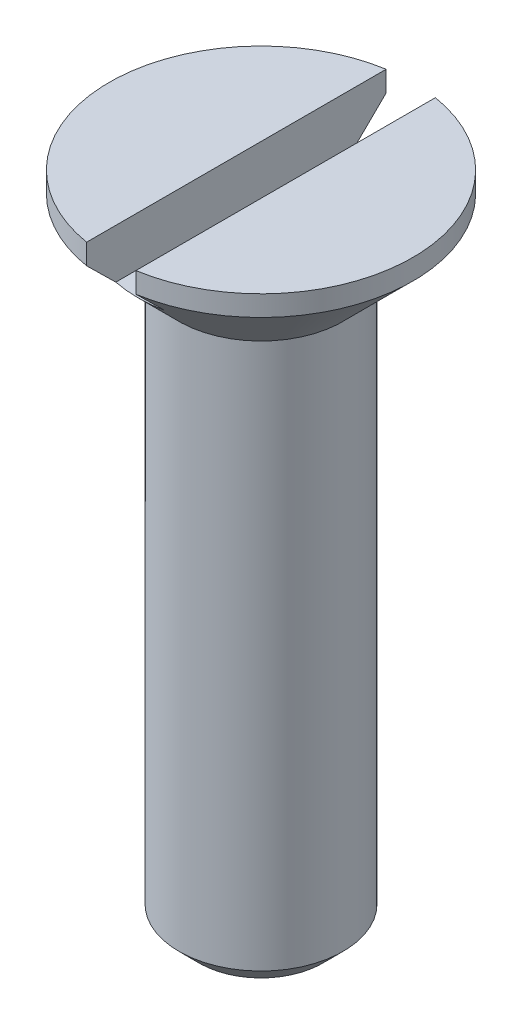
ISO-10303-21;
HEADER;
FILE_DESCRIPTION(('STEP AP214'),'2;1');
FILE_NAME('part.step','',(''),(''),'','','');
FILE_SCHEMA(('AUTOMOTIVE_DESIGN { 1 0 10303 214 1 1 1 1 }'));
ENDSEC;
DATA;
#1=APPLICATION_CONTEXT('core data for automotive mechanical design processes');
#2=APPLICATION_PROTOCOL_DEFINITION('international standard','automotive_design',2000,#1);
#3=PRODUCT_CONTEXT('',#1,'mechanical');
#4=PRODUCT('Part','Part','',(#3));
#5=PRODUCT_RELATED_PRODUCT_CATEGORY('part','',(#4));
#6=PRODUCT_DEFINITION_FORMATION('','',#4);
#7=PRODUCT_DEFINITION_CONTEXT('part definition',#1,'design');
#8=PRODUCT_DEFINITION('design','',#6,#7);
#9=PRODUCT_DEFINITION_SHAPE('','',#8);
#10=(LENGTH_UNIT() NAMED_UNIT(*) SI_UNIT(.MILLI.,.METRE.));
#11=(NAMED_UNIT(*) PLANE_ANGLE_UNIT() SI_UNIT($,.RADIAN.));
#12=(NAMED_UNIT(*) SI_UNIT($,.STERADIAN.) SOLID_ANGLE_UNIT());
#13=UNCERTAINTY_MEASURE_WITH_UNIT(LENGTH_MEASURE(1.E-05),#10,'distance_accuracy_value','');
#14=(GEOMETRIC_REPRESENTATION_CONTEXT(3) GLOBAL_UNCERTAINTY_ASSIGNED_CONTEXT((#13)) GLOBAL_UNIT_ASSIGNED_CONTEXT((#10,
#11,#12)) REPRESENTATION_CONTEXT('',''));
#15=CARTESIAN_POINT('',(0.,0.,0.));
#16=DIRECTION('',(0.,0.,1.));
#17=DIRECTION('',(1.,0.,0.));
#18=AXIS2_PLACEMENT_3D('',#15,#16,#17);
#19=CARTESIAN_POINT('',(-3.7,16.,0.));
#20=DIRECTION('',(0.,1.,0.));
#21=DIRECTION('',(-1.,0.,0.));
#22=AXIS2_PLACEMENT_3D('',#19,#20,#21);
#23=PLANE('',#22);
#24=DIRECTION('',(0.,0.,1.));
#25=VECTOR('',#24,1.);
#26=CARTESIAN_POINT('',(-0.6,16.,-3.7));
#27=LINE('',#26,#25);
#28=CARTESIAN_POINT('',(-0.6,16.,-3.65102725270574));
#29=VERTEX_POINT('',#28);
#30=CARTESIAN_POINT('',(-0.6,16.,3.65102725270574));
#31=VERTEX_POINT('',#30);
#32=EDGE_CURVE('E136',#29,#31,#27,.T.);
#33=ORIENTED_EDGE('',*,*,#32,.F.);
#34=CARTESIAN_POINT('',(0.,16.,0.));
#35=DIRECTION('',(0.,1.,0.));
#36=DIRECTION('',(-1.,0.,0.));
#37=AXIS2_PLACEMENT_3D('',#34,#35,#36);
#38=CIRCLE('',#37,3.7);
#39=EDGE_CURVE('E113',#29,#31,#38,.T.);
#40=ORIENTED_EDGE('',*,*,#39,.T.);
#41=EDGE_LOOP('',(#33,#40));
#42=FACE_BOUND('',#41,.T.);
#43=ADVANCED_FACE('F29',(#42),#23,.T.);
#44=CARTESIAN_POINT('',(0.,16.,0.));
#45=DIRECTION('',(0.,1.,0.));
#46=DIRECTION('',(-1.,0.,0.));
#47=AXIS2_PLACEMENT_3D('',#44,#45,#46);
#48=CYLINDRICAL_SURFACE('',#47,3.7);
#49=DIRECTION('',(0.,1.,0.));
#50=VECTOR('',#49,1.);
#51=CARTESIAN_POINT('',(-0.6,16.,3.65102725270574));
#52=LINE('',#51,#50);
#53=CARTESIAN_POINT('',(-0.6,15.5,3.65102725270574));
#54=VERTEX_POINT('',#53);
#55=EDGE_CURVE('E57',#31,#54,#52,.F.);
#56=ORIENTED_EDGE('',*,*,#55,.F.);
#57=ORIENTED_EDGE('',*,*,#39,.F.);
#58=DIRECTION('',(0.,1.,0.));
#59=VECTOR('',#58,1.);
#60=CARTESIAN_POINT('',(-0.6,16.,-3.65102725270574));
#61=LINE('',#60,#59);
#62=CARTESIAN_POINT('',(-0.6,15.5,-3.65102725270574));
#63=VERTEX_POINT('',#62);
#64=EDGE_CURVE('E130',#63,#29,#61,.T.);
#65=ORIENTED_EDGE('',*,*,#64,.F.);
#66=CARTESIAN_POINT('',(0.,15.5,0.));
#67=DIRECTION('',(0.,1.,0.));
#68=DIRECTION('',(-1.,0.,0.));
#69=AXIS2_PLACEMENT_3D('',#66,#67,#68);
#70=CIRCLE('',#69,3.7);
#71=EDGE_CURVE('E117',#63,#54,#70,.T.);
#72=ORIENTED_EDGE('',*,*,#71,.T.);
#73=EDGE_LOOP('',(#56,#57,#65,#72));
#74=FACE_BOUND('',#73,.T.);
#75=ADVANCED_FACE('F146',(#74),#48,.T.);
#76=DIRECTION('',(0.,0.,1.));
#77=VECTOR('',#76,1.);
#78=CARTESIAN_POINT('',(0.6,16.,-3.7));
#79=LINE('',#78,#77);
#80=CARTESIAN_POINT('',(0.6,16.,-3.65102725270574));
#81=VERTEX_POINT('',#80);
#82=CARTESIAN_POINT('',(0.6,16.,3.65102725270574));
#83=VERTEX_POINT('',#82);
#84=EDGE_CURVE('E100',#81,#83,#79,.T.);
#85=ORIENTED_EDGE('',*,*,#84,.T.);
#86=EDGE_CURVE('E111',#83,#81,#38,.T.);
#87=ORIENTED_EDGE('',*,*,#86,.T.);
#88=EDGE_LOOP('',(#85,#87));
#89=FACE_BOUND('',#88,.T.);
#90=ADVANCED_FACE('F31',(#89),#23,.T.);
#91=DIRECTION('',(0.,1.,0.));
#92=VECTOR('',#91,1.);
#93=CARTESIAN_POINT('',(0.6,16.,-3.65102725270574));
#94=LINE('',#93,#92);
#95=CARTESIAN_POINT('',(0.6,15.5,-3.65102725270574));
#96=VERTEX_POINT('',#95);
#97=EDGE_CURVE('E132',#81,#96,#94,.F.);
#98=ORIENTED_EDGE('',*,*,#97,.F.);
#99=ORIENTED_EDGE('',*,*,#86,.F.);
#100=DIRECTION('',(0.,1.,0.));
#101=VECTOR('',#100,1.);
#102=CARTESIAN_POINT('',(0.6,16.,3.65102725270574));
#103=LINE('',#102,#101);
#104=CARTESIAN_POINT('',(0.6,15.5,3.65102725270574));
#105=VERTEX_POINT('',#104);
#106=EDGE_CURVE('E134',#105,#83,#103,.T.);
#107=ORIENTED_EDGE('',*,*,#106,.F.);
#108=EDGE_CURVE('E106',#105,#96,#70,.T.);
#109=ORIENTED_EDGE('',*,*,#108,.T.);
#110=EDGE_LOOP('',(#98,#99,#107,#109));
#111=FACE_BOUND('',#110,.T.);
#112=ADVANCED_FACE('F153',(#111),#48,.T.);
#113=CARTESIAN_POINT('',(0.,15.5,0.));
#114=DIRECTION('',(0.,1.,0.));
#115=DIRECTION('',(-1.,0.,0.));
#116=AXIS2_PLACEMENT_3D('',#113,#114,#115);
#117=CONICAL_SURFACE('',#116,3.7,0.785398163397443);
#118=CARTESIAN_POINT('',(-0.600000000000001,19.9600206241956,8.13793196010486));
#119=CARTESIAN_POINT('',(-0.600000000000001,19.6768912812845,7.85402777231897));
#120=CARTESIAN_POINT('',(-0.600000000000001,19.3937960861909,7.57008950002177));
#121=CARTESIAN_POINT('',(-0.600000000000001,18.8277099701475,7.00209082271699));
#122=CARTESIAN_POINT('',(-0.600000000000001,18.5447190528461,6.71803041407336));
#123=CARTESIAN_POINT('',(-0.6,17.9786826072545,6.14953775036887));
#124=CARTESIAN_POINT('',(-0.6,17.6956371983772,5.86510537638401));
#125=CARTESIAN_POINT('',(-0.6,17.1297993439922,5.29600682483286));
#126=CARTESIAN_POINT('',(-0.6,16.8470068908349,5.01134065487302));
#127=CARTESIAN_POINT('',(-0.6,16.2857333258305,4.44556875001048));
#128=CARTESIAN_POINT('',(-0.6,16.0072468080645,4.16446838236597));
#129=CARTESIAN_POINT('',(-0.6,15.590024020769,3.74228982182658));
#130=CARTESIAN_POINT('',(-0.6,15.4510275685893,3.60146883259404));
#131=CARTESIAN_POINT('',(-0.6,15.1732845807478,3.31958319518965));
#132=CARTESIAN_POINT('',(-0.6,15.0345380427178,3.17851854935184));
#133=CARTESIAN_POINT('',(-0.6,14.7574716483417,2.89609946410979));
#134=CARTESIAN_POINT('',(-0.6,14.6191516232573,2.75474519043096));
#135=CARTESIAN_POINT('',(-0.6,14.3430715265049,2.47148070482769));
#136=CARTESIAN_POINT('',(-0.6,14.2053114754901,2.32957047277055));
#137=CARTESIAN_POINT('',(-0.6,13.9307416741205,2.04487556787213));
#138=CARTESIAN_POINT('',(-0.6,13.7939317680324,1.90209104591261));
#139=CARTESIAN_POINT('',(-0.6,13.590052838059,1.68665676476746));
#140=CARTESIAN_POINT('',(-0.6,13.5223178394474,1.61463791010643));
#141=CARTESIAN_POINT('',(-0.6,13.3875043812597,1.4699889932015));
#142=CARTESIAN_POINT('',(-0.599999999999999,13.3204259074044,1.39735894431496));
#143=CARTESIAN_POINT('',(-0.599999999999999,13.2173706745269,1.28421539613836));
#144=CARTESIAN_POINT('',(-0.599999999999999,13.1810405202052,1.2440240295227));
#145=CARTESIAN_POINT('',(-0.599999999999999,13.1087770132124,1.16328117926467));
#146=CARTESIAN_POINT('',(-0.599999999999999,13.0728436840885,1.12272967450692));
#147=CARTESIAN_POINT('',(-0.599999999999999,13.0013920679676,1.04102691374381));
#148=CARTESIAN_POINT('',(-0.599999999999999,12.9658755254704,0.999874128580938));
#149=CARTESIAN_POINT('',(-0.599999999999999,12.8955848764335,0.916946976871492));
#150=CARTESIAN_POINT('',(-0.599999999999999,12.8608106613816,0.875172702709307));
#151=CARTESIAN_POINT('',(-0.599999999999999,12.7951073704694,0.794199307952508));
#152=CARTESIAN_POINT('',(-0.599999999999999,12.7640957564819,0.755067466057448));
#153=CARTESIAN_POINT('',(-0.599999999999999,12.70336797524,0.675813657835009));
#154=CARTESIAN_POINT('',(-0.599999999999999,12.6736515728167,0.635691873338649));
#155=CARTESIAN_POINT('',(-0.599999999999999,12.6162266564774,0.554135181970052));
#156=CARTESIAN_POINT('',(-0.599999999999999,12.5885144284908,0.512702919788469));
#157=CARTESIAN_POINT('',(-0.599999999999999,12.5362152220562,0.427935425074672));
#158=CARTESIAN_POINT('',(-0.599999999999999,12.5116239202379,0.384602939456321));
#159=CARTESIAN_POINT('',(-0.599999999999999,12.4707712434462,0.301726491885902));
#160=CARTESIAN_POINT('',(-0.599999999999999,12.45382070719,0.262532602955209));
#161=CARTESIAN_POINT('',(-0.599999999999999,12.4259082860384,0.182109312015814));
#162=CARTESIAN_POINT('',(-0.599999999999999,12.4149229507895,0.140888585704842));
#163=CARTESIAN_POINT('',(-0.599999999999999,12.402410068702,0.0639247858075805));
#164=CARTESIAN_POINT('',(-0.599999999999999,12.399623491487,0.028396759902531));
#165=CARTESIAN_POINT('',(-0.599999999999999,12.4004601247094,-0.0425631065150444));
#166=CARTESIAN_POINT('',(-0.599999999999999,12.4040811986865,-0.077994975143779));
#167=CARTESIAN_POINT('',(-0.599999999999999,12.4191108613007,-0.159349986954461));
#168=CARTESIAN_POINT('',(-0.599999999999999,12.4327039139323,-0.20485529370531));
#169=CARTESIAN_POINT('',(-0.599999999999999,12.4581067891676,-0.271162915462729));
#170=CARTESIAN_POINT('',(-0.599999999999999,12.4674488375851,-0.293008638455437));
#171=CARTESIAN_POINT('',(-0.599999999999999,12.4874539712061,-0.33608723947898));
#172=CARTESIAN_POINT('',(-0.599999999999999,12.4981167229907,-0.357320270525158));
#173=CARTESIAN_POINT('',(-0.599999999999999,12.5293955558104,-0.415982831640734));
#174=CARTESIAN_POINT('',(-0.599999999999999,12.5511562438045,-0.452795694277309));
#175=CARTESIAN_POINT('',(-0.599999999999999,12.5968220812861,-0.525077964984175));
#176=CARTESIAN_POINT('',(-0.599999999999999,12.6207290147926,-0.560546219893617));
#177=CARTESIAN_POINT('',(-0.599999999999999,12.6700419571545,-0.630548437000606));
#178=CARTESIAN_POINT('',(-0.599999999999999,12.6954515253791,-0.665079873092593));
#179=CARTESIAN_POINT('',(-0.599999999999999,12.7472851044206,-0.733375806005264));
#180=CARTESIAN_POINT('',(-0.599999999999999,12.7737092812768,-0.767140175845271));
#181=CARTESIAN_POINT('',(-0.599999999999999,12.8543413496578,-0.867919244140574));
#182=CARTESIAN_POINT('',(-0.599999999999999,12.9096425797587,-0.934056109051659));
#183=CARTESIAN_POINT('',(-0.599999999999999,13.0217665413016,-1.06481071116442));
#184=CARTESIAN_POINT('',(-0.599999999999999,13.0785865034983,-1.12943085704486));
#185=CARTESIAN_POINT('',(-0.599999999999999,13.192411871062,-1.25682824367003));
#186=CARTESIAN_POINT('',(-0.6,13.2494025997098,-1.31961861941934));
#187=CARTESIAN_POINT('',(-0.6,13.3640447884687,-1.4445928705812));
#188=CARTESIAN_POINT('',(-0.6,13.421696258976,-1.50677673642226));
#189=CARTESIAN_POINT('',(-0.6,13.5953422390028,-1.69270278432731));
#190=CARTESIAN_POINT('',(-0.6,13.7120179337594,-1.81580796723865));
#191=CARTESIAN_POINT('',(-0.6,13.9464428075932,-2.06118874847637));
#192=CARTESIAN_POINT('',(-0.6,14.0641928200843,-2.1834635464702));
#193=CARTESIAN_POINT('',(-0.6,14.3002889030881,-2.42742423040903));
#194=CARTESIAN_POINT('',(-0.6,14.4186349433499,-2.54911014563965));
#195=CARTESIAN_POINT('',(-0.6,14.6550071781253,-2.79137280615522));
#196=CARTESIAN_POINT('',(-0.6,14.7730310413632,-2.91195182898457));
#197=CARTESIAN_POINT('',(-0.6,15.0093478155032,-3.15284893689321));
#198=CARTESIAN_POINT('',(-0.6,15.1276407298919,-3.27316701855099));
#199=CARTESIAN_POINT('',(-0.6,15.4827271369743,-3.63376526150927));
#200=CARTESIAN_POINT('',(-0.6,15.7198037469923,-3.8737665286327));
#201=CARTESIAN_POINT('',(-0.6,16.2886319592405,-4.4486113379014));
#202=CARTESIAN_POINT('',(-0.6,16.6205820339942,-4.78325830289925));
#203=CARTESIAN_POINT('',(-0.6,17.2849478138358,-5.45216769917094));
#204=CARTESIAN_POINT('',(-0.6,17.6173635691108,-5.78643008057175));
#205=CARTESIAN_POINT('',(-0.6,18.2847457930005,-6.45701285565818));
#206=CARTESIAN_POINT('',(-0.6,18.6197140122828,-6.79333150662992));
#207=CARTESIAN_POINT('',(-0.600000000000001,19.2897808105559,-7.46575829971184));
#208=CARTESIAN_POINT('',(-0.600000000000001,19.6248793690147,-7.80186646228028));
#209=CARTESIAN_POINT('',(-0.600000000000001,19.9600206241956,-8.13793196010486));
#210=B_SPLINE_CURVE_WITH_KNOTS('',3,(#118,#119,#120,#121,#122,#123,#124,#125,#126,#127,#128,
#129,#130,#131,#132,#133,#134,#135,#136,#137,#138,#139,#140,#141,#142,#143,#144,#145,#146,#147,
#148,#149,#150,#151,#152,#153,#154,#155,#156,#157,#158,#159,#160,#161,#162,#163,#164,#165,#166,
#167,#168,#169,#170,#171,#172,#173,#174,#175,#176,#177,#178,#179,#180,#181,#182,#183,#184,#185,
#186,#187,#188,#189,#190,#191,#192,#193,#194,#195,#196,#197,#198,#199,#200,#201,#202,#203,#204,
#205,#206,#207,#208,#209),.UNSPECIFIED.,.F.,.F.,(4,2,2,2,2,2,2,2,2,2,2,2,2,2,2,2,2,2,2,2,2,2,2,
2,2,2,2,2,2,2,2,2,2,2,2,2,2,2,2,2,2,2,2,2,2,4),(0.,1.20286091475451,2.40576053584867,
3.6095661884296,4.81333411531857,6.00040930817248,6.59400413473686,7.18759330634946,
7.78090579697013,8.3742399753186,8.96747449255334,9.26407415171825,9.56066734558071,
9.72319861560584,9.8857394788069,10.0488126207255,10.2118617593269,10.3616347814149,
10.5113804952798,10.6608411897885,10.8100925247216,10.9379019301194,11.0652051861339,
11.1715563779878,11.2778721165553,11.4194479223042,11.4907036241509,11.5619413736212,
11.6901080531411,11.8183822726337,11.9469735623142,12.0755859862179,12.3341618029342,
12.5922945826552,12.8466786122313,13.1010666498338,13.6098890890932,14.1191470825747,
14.6283794844877,15.1345611743106,15.6407494616194,16.652802387767,18.0668791450929,
19.4811222704145,20.9051395740233,22.3289855542461),.UNSPECIFIED.);
#211=CARTESIAN_POINT('',(-0.6,14.8,2.9393876913398));
#212=VERTEX_POINT('',#211);
#213=EDGE_CURVE('E11',#54,#212,#210,.T.);
#214=ORIENTED_EDGE('',*,*,#213,.F.);
#215=ORIENTED_EDGE('',*,*,#71,.F.);
#216=CARTESIAN_POINT('',(-0.6,14.8,-2.9393876913398));
#217=VERTEX_POINT('',#216);
#218=EDGE_CURVE('E33',#217,#63,#210,.T.);
#219=ORIENTED_EDGE('',*,*,#218,.F.);
#220=CARTESIAN_POINT('',(0.,14.8,0.));
#221=DIRECTION('',(0.,-1.,0.));
#222=DIRECTION('',(0.,0.,-1.));
#223=AXIS2_PLACEMENT_3D('',#220,#221,#222);
#224=CIRCLE('',#223,2.99999999999999);
#225=CARTESIAN_POINT('',(0.6,14.8,-2.9393876913398));
#226=VERTEX_POINT('',#225);
#227=EDGE_CURVE('E93',#226,#217,#224,.F.);
#228=ORIENTED_EDGE('',*,*,#227,.F.);
#229=CARTESIAN_POINT('',(0.600000000000001,19.9600206241956,-8.13793196010485));
#230=CARTESIAN_POINT('',(0.600000000000001,19.6768912812845,-7.85402777231897));
#231=CARTESIAN_POINT('',(0.600000000000001,19.3937960861909,-7.57008950002176));
#232=CARTESIAN_POINT('',(0.600000000000001,18.8277099701475,-7.00209082271699));
#233=CARTESIAN_POINT('',(0.600000000000001,18.5447190528461,-6.71803041407336));
#234=CARTESIAN_POINT('',(0.6,17.9786826072545,-6.14953775036887));
#235=CARTESIAN_POINT('',(0.6,17.6956371983772,-5.86510537638401));
#236=CARTESIAN_POINT('',(0.6,17.1297993439922,-5.29600682483287));
#237=CARTESIAN_POINT('',(0.6,16.8470068908349,-5.01134065487302));
#238=CARTESIAN_POINT('',(0.6,16.2857333258306,-4.44556875001049));
#239=CARTESIAN_POINT('',(0.6,16.0072468080645,-4.16446838236598));
#240=CARTESIAN_POINT('',(0.6,15.590024020769,-3.74228982182658));
#241=CARTESIAN_POINT('',(0.6,15.4510275685893,-3.60146883259404));
#242=CARTESIAN_POINT('',(0.6,15.1732845807478,-3.31958319518966));
#243=CARTESIAN_POINT('',(0.6,15.0345380427178,-3.17851854935184));
#244=CARTESIAN_POINT('',(0.6,14.7574716483417,-2.89609946410979));
#245=CARTESIAN_POINT('',(0.6,14.6191516232573,-2.75474519043096));
#246=CARTESIAN_POINT('',(0.6,14.3430715265049,-2.47148070482769));
#247=CARTESIAN_POINT('',(0.6,14.2053114754901,-2.32957047277055));
#248=CARTESIAN_POINT('',(0.6,13.9307416741205,-2.04487556787213));
#249=CARTESIAN_POINT('',(0.6,13.7939317680324,-1.90209104591261));
#250=CARTESIAN_POINT('',(0.6,13.590052838059,-1.68665676476746));
#251=CARTESIAN_POINT('',(0.6,13.5223178394474,-1.61463791010643));
#252=CARTESIAN_POINT('',(0.6,13.3875043812597,-1.4699889932015));
#253=CARTESIAN_POINT('',(0.599999999999999,13.3204259074044,-1.39735894431496));
#254=CARTESIAN_POINT('',(0.599999999999999,13.2173706745269,-1.28421539613837));
#255=CARTESIAN_POINT('',(0.599999999999999,13.1810405202052,-1.2440240295227));
#256=CARTESIAN_POINT('',(0.599999999999999,13.1087770132124,-1.16328117926467));
#257=CARTESIAN_POINT('',(0.599999999999999,13.0728436840885,-1.12272967450692));
#258=CARTESIAN_POINT('',(0.599999999999999,13.0013920679676,-1.04102691374381));
#259=CARTESIAN_POINT('',(0.599999999999999,12.9658755254704,-0.999874128580939));
#260=CARTESIAN_POINT('',(0.599999999999999,12.8955848764335,-0.916946976871493));
#261=CARTESIAN_POINT('',(0.599999999999999,12.8608106613816,-0.875172702709308));
#262=CARTESIAN_POINT('',(0.599999999999999,12.7951073704694,-0.794199307952508));
#263=CARTESIAN_POINT('',(0.599999999999999,12.7640957564819,-0.755067466057448));
#264=CARTESIAN_POINT('',(0.599999999999999,12.70336797524,-0.675813657835008));
#265=CARTESIAN_POINT('',(0.599999999999999,12.6736515728167,-0.635691873338648));
#266=CARTESIAN_POINT('',(0.599999999999999,12.6162266564774,-0.55413518197005));
#267=CARTESIAN_POINT('',(0.599999999999999,12.5885144284908,-0.512702919788466));
#268=CARTESIAN_POINT('',(0.599999999999999,12.5362152220562,-0.427935425074668));
#269=CARTESIAN_POINT('',(0.599999999999999,12.5116239202379,-0.384602939456317));
#270=CARTESIAN_POINT('',(0.599999999999999,12.4707712434462,-0.301726491885898));
#271=CARTESIAN_POINT('',(0.599999999999999,12.45382070719,-0.262532602955204));
#272=CARTESIAN_POINT('',(0.599999999999999,12.4259082860384,-0.182109312015809));
#273=CARTESIAN_POINT('',(0.599999999999999,12.4149229507895,-0.140888585704836));
#274=CARTESIAN_POINT('',(0.599999999999999,12.402410068702,-0.0639247858075747));
#275=CARTESIAN_POINT('',(0.599999999999999,12.399623491487,-0.0283967599025251));
#276=CARTESIAN_POINT('',(0.599999999999999,12.4004601247095,0.0425631065150508));
#277=CARTESIAN_POINT('',(0.599999999999999,12.4040811986865,0.0779949751437855));
#278=CARTESIAN_POINT('',(0.599999999999999,12.4191108613007,0.159349986954469));
#279=CARTESIAN_POINT('',(0.599999999999999,12.4327039139323,0.204855293705319));
#280=CARTESIAN_POINT('',(0.599999999999999,12.4581067891676,0.271162915462739));
#281=CARTESIAN_POINT('',(0.599999999999999,12.4674488375851,0.293008638455447));
#282=CARTESIAN_POINT('',(0.599999999999999,12.4874539712061,0.33608723947899));
#283=CARTESIAN_POINT('',(0.599999999999999,12.4981167229907,0.357320270525169));
#284=CARTESIAN_POINT('',(0.599999999999999,12.5293955558104,0.415982831640747));
#285=CARTESIAN_POINT('',(0.599999999999999,12.5511562438045,0.452795694277323));
#286=CARTESIAN_POINT('',(0.599999999999999,12.5968220812861,0.525077964984193));
#287=CARTESIAN_POINT('',(0.599999999999999,12.6207290147927,0.560546219893637));
#288=CARTESIAN_POINT('',(0.599999999999999,12.6700419571546,0.630548437000628));
#289=CARTESIAN_POINT('',(0.599999999999999,12.6954515253791,0.665079873092615));
#290=CARTESIAN_POINT('',(0.599999999999999,12.7472851044206,0.733375806005288));
#291=CARTESIAN_POINT('',(0.599999999999999,12.7737092812768,0.767140175845297));
#292=CARTESIAN_POINT('',(0.599999999999999,12.8543413496578,0.867919244140606));
#293=CARTESIAN_POINT('',(0.599999999999999,12.9096425797587,0.934056109051693));
#294=CARTESIAN_POINT('',(0.599999999999999,13.0217665413016,1.06481071116445));
#295=CARTESIAN_POINT('',(0.599999999999999,13.0785865034983,1.1294308570449));
#296=CARTESIAN_POINT('',(0.599999999999999,13.192411871062,1.25682824367007));
#297=CARTESIAN_POINT('',(0.6,13.2494025997099,1.31961861941939));
#298=CARTESIAN_POINT('',(0.6,13.3640447884688,1.44459287058125));
#299=CARTESIAN_POINT('',(0.6,13.4216962589761,1.50677673642231));
#300=CARTESIAN_POINT('',(0.6,13.5953422390029,1.69270278432737));
#301=CARTESIAN_POINT('',(0.6,13.7120179337595,1.81580796723872));
#302=CARTESIAN_POINT('',(0.6,13.9464428075933,2.06118874847645));
#303=CARTESIAN_POINT('',(0.6,14.0641928200844,2.18346354647029));
#304=CARTESIAN_POINT('',(0.6,14.3002889030882,2.42742423040913));
#305=CARTESIAN_POINT('',(0.6,14.41863494335,2.54911014563975));
#306=CARTESIAN_POINT('',(0.6,14.6550071781254,2.79137280615533));
#307=CARTESIAN_POINT('',(0.6,14.7730310413633,2.91195182898469));
#308=CARTESIAN_POINT('',(0.6,15.0093478155033,3.15284893689334));
#309=CARTESIAN_POINT('',(0.6,15.1276407298921,3.27316701855113));
#310=CARTESIAN_POINT('',(0.6,15.4827271369744,3.63376526150942));
#311=CARTESIAN_POINT('',(0.6,15.7198037469925,3.87376652863286));
#312=CARTESIAN_POINT('',(0.6,16.2886319592406,4.44861133790156));
#313=CARTESIAN_POINT('',(0.6,16.6205820339944,4.7832583028994));
#314=CARTESIAN_POINT('',(0.6,17.2849478138359,5.45216769917105));
#315=CARTESIAN_POINT('',(0.6,17.6173635691109,5.78643008057185));
#316=CARTESIAN_POINT('',(0.6,18.2847457930006,6.45701285565825));
#317=CARTESIAN_POINT('',(0.6,18.6197140122829,6.79333150662997));
#318=CARTESIAN_POINT('',(0.600000000000001,19.2897808105559,7.46575829971186));
#319=CARTESIAN_POINT('',(0.600000000000001,19.6248793690147,7.80186646228029));
#320=CARTESIAN_POINT('',(0.600000000000001,19.9600206241956,8.13793196010485));
#321=B_SPLINE_CURVE_WITH_KNOTS('',3,(#229,#230,#231,#232,#233,#234,#235,#236,#237,#238,#239,
#240,#241,#242,#243,#244,#245,#246,#247,#248,#249,#250,#251,#252,#253,#254,#255,#256,#257,#258,
#259,#260,#261,#262,#263,#264,#265,#266,#267,#268,#269,#270,#271,#272,#273,#274,#275,#276,#277,
#278,#279,#280,#281,#282,#283,#284,#285,#286,#287,#288,#289,#290,#291,#292,#293,#294,#295,#296,
#297,#298,#299,#300,#301,#302,#303,#304,#305,#306,#307,#308,#309,#310,#311,#312,#313,#314,#315,
#316,#317,#318,#319,#320),.UNSPECIFIED.,.F.,.F.,(4,2,2,2,2,2,2,2,2,2,2,2,2,2,2,2,2,2,2,2,2,2,2,
2,2,2,2,2,2,2,2,2,2,2,2,2,2,2,2,2,2,2,2,2,2,4),(0.,1.20286091475451,2.40576053584866,
3.60956618842959,4.81333411531856,6.00040930817247,6.59400413473685,7.18759330634945,
7.78090579697012,8.37423997531859,8.96747449255333,9.26407415171825,9.5606673455807,
9.72319861560583,9.88573947880689,10.0488126207255,10.2118617593269,10.3616347814149,
10.5113804952798,10.6608411897885,10.8100925247216,10.9379019301194,11.0652051861339,
11.1715563779878,11.2778721165554,11.4194479223042,11.4907036241509,11.5619413736212,
11.6901080531411,11.8183822726337,11.9469735623142,12.075585986218,12.3341618029343,
12.5922945826552,12.8466786122314,13.1010666498339,13.6098890890933,14.1191470825748,
14.6283794844878,15.1345611743108,15.6407494616196,16.6528023877673,18.066879145093,
19.4811222704146,20.9051395740234,22.3289855542461),.UNSPECIFIED.);
#322=EDGE_CURVE('E98',#96,#226,#321,.T.);
#323=ORIENTED_EDGE('',*,*,#322,.F.);
#324=ORIENTED_EDGE('',*,*,#108,.F.);
#325=CARTESIAN_POINT('',(0.6,14.8,2.9393876913398));
#326=VERTEX_POINT('',#325);
#327=EDGE_CURVE('E43',#326,#105,#321,.T.);
#328=ORIENTED_EDGE('',*,*,#327,.F.);
#329=EDGE_CURVE('E86',#212,#326,#224,.F.);
#330=ORIENTED_EDGE('',*,*,#329,.F.);
#331=EDGE_LOOP('',(#214,#215,#219,#228,#323,#324,#328,#330));
#332=FACE_BOUND('',#331,.T.);
#333=CARTESIAN_POINT('',(0.,13.8,0.));
#334=DIRECTION('',(0.,1.,0.));
#335=DIRECTION('',(-1.,0.,0.));
#336=AXIS2_PLACEMENT_3D('',#333,#334,#335);
#337=CIRCLE('',#336,2.);
#338=CARTESIAN_POINT('',(-2.,13.8,0.));
#339=VERTEX_POINT('',#338);
#340=EDGE_CURVE('E120',#339,#339,#337,.T.);
#341=ORIENTED_EDGE('',*,*,#340,.T.);
#342=EDGE_LOOP('',(#341));
#343=FACE_BOUND('',#342,.T.);
#344=ADVANCED_FACE('F103',(#332,#343),#117,.T.);
#345=CARTESIAN_POINT('',(0.,16.,0.));
#346=DIRECTION('',(0.,1.,0.));
#347=DIRECTION('',(-1.,0.,0.));
#348=AXIS2_PLACEMENT_3D('',#345,#346,#347);
#349=CYLINDRICAL_SURFACE('',#348,2.);
#350=CARTESIAN_POINT('',(0.,0.499999999999997,0.));
#351=DIRECTION('',(0.,1.,0.));
#352=DIRECTION('',(-1.,0.,0.));
#353=AXIS2_PLACEMENT_3D('',#350,#351,#352);
#354=CIRCLE('',#353,2.);
#355=CARTESIAN_POINT('',(-2.,0.499999999999997,0.));
#356=VERTEX_POINT('',#355);
#357=EDGE_CURVE('E123',#356,#356,#354,.T.);
#358=ORIENTED_EDGE('',*,*,#357,.T.);
#359=EDGE_LOOP('',(#358));
#360=FACE_BOUND('',#359,.T.);
#361=ORIENTED_EDGE('',*,*,#340,.F.);
#362=EDGE_LOOP('',(#361));
#363=FACE_BOUND('',#362,.T.);
#364=ADVANCED_FACE('F166',(#360,#363),#349,.T.);
#365=CARTESIAN_POINT('',(0.,0.499999999999997,0.));
#366=DIRECTION('',(0.,1.,0.));
#367=DIRECTION('',(-1.,0.,0.));
#368=AXIS2_PLACEMENT_3D('',#365,#366,#367);
#369=CONICAL_SURFACE('',#368,2.,0.78539816339745);
#370=CARTESIAN_POINT('',(0.,0.,0.));
#371=DIRECTION('',(0.,1.,0.));
#372=DIRECTION('',(-1.,0.,0.));
#373=AXIS2_PLACEMENT_3D('',#370,#371,#372);
#374=CIRCLE('',#373,1.5);
#375=CARTESIAN_POINT('',(-1.5,0.,0.));
#376=VERTEX_POINT('',#375);
#377=EDGE_CURVE('E126',#376,#376,#374,.T.);
#378=ORIENTED_EDGE('',*,*,#377,.T.);
#379=EDGE_LOOP('',(#378));
#380=FACE_BOUND('',#379,.T.);
#381=ORIENTED_EDGE('',*,*,#357,.F.);
#382=EDGE_LOOP('',(#381));
#383=FACE_BOUND('',#382,.T.);
#384=ADVANCED_FACE('F172',(#380,#383),#369,.T.);
#385=CARTESIAN_POINT('',(0.,0.,0.));
#386=DIRECTION('',(0.,-1.,0.));
#387=DIRECTION('',(1.,0.,0.));
#388=AXIS2_PLACEMENT_3D('',#385,#386,#387);
#389=PLANE('',#388);
#390=ORIENTED_EDGE('',*,*,#377,.F.);
#391=EDGE_LOOP('',(#390));
#392=FACE_BOUND('',#391,.T.);
#393=ADVANCED_FACE('F176',(#392),#389,.T.);
#394=CARTESIAN_POINT('',(-0.6,16.,-3.7));
#395=DIRECTION('',(-1.,0.,0.));
#396=DIRECTION('',(0.,-1.,0.));
#397=AXIS2_PLACEMENT_3D('',#394,#395,#396);
#398=PLANE('',#397);
#399=ORIENTED_EDGE('',*,*,#55,.T.);
#400=ORIENTED_EDGE('',*,*,#213,.T.);
#401=DIRECTION('',(0.,0.,1.));
#402=VECTOR('',#401,1.);
#403=CARTESIAN_POINT('',(-0.6,14.8,-3.7));
#404=LINE('',#403,#402);
#405=EDGE_CURVE('E89',#217,#212,#404,.T.);
#406=ORIENTED_EDGE('',*,*,#405,.F.);
#407=ORIENTED_EDGE('',*,*,#218,.T.);
#408=ORIENTED_EDGE('',*,*,#64,.T.);
#409=ORIENTED_EDGE('',*,*,#32,.T.);
#410=EDGE_LOOP('',(#399,#400,#406,#407,#408,#409));
#411=FACE_BOUND('',#410,.T.);
#412=ADVANCED_FACE('F141',(#411),#398,.F.);
#413=CARTESIAN_POINT('',(0.6,16.,-3.7));
#414=DIRECTION('',(1.,0.,0.));
#415=DIRECTION('',(0.,1.,0.));
#416=AXIS2_PLACEMENT_3D('',#413,#414,#415);
#417=PLANE('',#416);
#418=ORIENTED_EDGE('',*,*,#97,.T.);
#419=ORIENTED_EDGE('',*,*,#322,.T.);
#420=DIRECTION('',(0.,0.,1.));
#421=VECTOR('',#420,1.);
#422=CARTESIAN_POINT('',(0.6,14.8,-3.7));
#423=LINE('',#422,#421);
#424=EDGE_CURVE('E50',#226,#326,#423,.T.);
#425=ORIENTED_EDGE('',*,*,#424,.T.);
#426=ORIENTED_EDGE('',*,*,#327,.T.);
#427=ORIENTED_EDGE('',*,*,#106,.T.);
#428=ORIENTED_EDGE('',*,*,#84,.F.);
#429=EDGE_LOOP('',(#418,#419,#425,#426,#427,#428));
#430=FACE_BOUND('',#429,.T.);
#431=ADVANCED_FACE('F95',(#430),#417,.F.);
#432=CARTESIAN_POINT('',(-0.6,14.8,-3.7));
#433=DIRECTION('',(0.,-1.,0.));
#434=DIRECTION('',(0.,0.,-1.));
#435=AXIS2_PLACEMENT_3D('',#432,#433,#434);
#436=PLANE('',#435);
#437=ORIENTED_EDGE('',*,*,#329,.T.);
#438=ORIENTED_EDGE('',*,*,#424,.F.);
#439=ORIENTED_EDGE('',*,*,#227,.T.);
#440=ORIENTED_EDGE('',*,*,#405,.T.);
#441=EDGE_LOOP('',(#437,#438,#439,#440));
#442=FACE_BOUND('',#441,.T.);
#443=ADVANCED_FACE('F87',(#442),#436,.F.);
#444=CLOSED_SHELL('',(#43,#75,#90,#112,#344,#364,#384,#393,#412,#431,#443));
#445=MANIFOLD_SOLID_BREP('B2',#444);
#446=ADVANCED_BREP_SHAPE_REPRESENTATION('',(#18,#445),#14);
#447=SHAPE_DEFINITION_REPRESENTATION(#9,#446);
ENDSEC;
END-ISO-10303-21;
